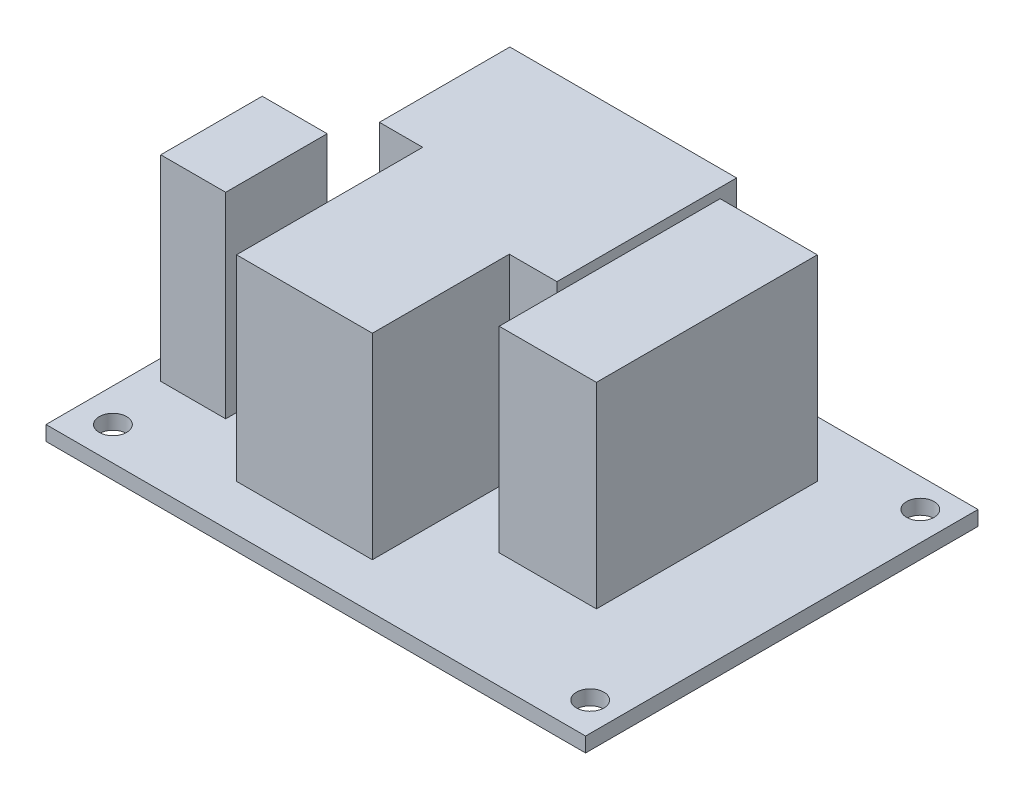
ISO-10303-21;
HEADER;
FILE_DESCRIPTION(('STEP AP214'),'2;1');
FILE_NAME('part.step','',(''),(''),'','','');
FILE_SCHEMA(('AUTOMOTIVE_DESIGN { 1 0 10303 214 1 1 1 1 }'));
ENDSEC;
DATA;
#1=APPLICATION_CONTEXT('core data for automotive mechanical design processes');
#2=APPLICATION_PROTOCOL_DEFINITION('international standard','automotive_design',2000,#1);
#3=PRODUCT_CONTEXT('',#1,'mechanical');
#4=PRODUCT('Part','Part','',(#3));
#5=PRODUCT_RELATED_PRODUCT_CATEGORY('part','',(#4));
#6=PRODUCT_DEFINITION_FORMATION('','',#4);
#7=PRODUCT_DEFINITION_CONTEXT('part definition',#1,'design');
#8=PRODUCT_DEFINITION('design','',#6,#7);
#9=PRODUCT_DEFINITION_SHAPE('','',#8);
#10=(LENGTH_UNIT() NAMED_UNIT(*) SI_UNIT(.MILLI.,.METRE.));
#11=(NAMED_UNIT(*) PLANE_ANGLE_UNIT() SI_UNIT($,.RADIAN.));
#12=(NAMED_UNIT(*) SI_UNIT($,.STERADIAN.) SOLID_ANGLE_UNIT());
#13=UNCERTAINTY_MEASURE_WITH_UNIT(LENGTH_MEASURE(1.E-05),#10,'distance_accuracy_value','');
#14=(GEOMETRIC_REPRESENTATION_CONTEXT(3) GLOBAL_UNCERTAINTY_ASSIGNED_CONTEXT((#13)) GLOBAL_UNIT_ASSIGNED_CONTEXT((#10,
#11,#12)) REPRESENTATION_CONTEXT('',''));
#15=CARTESIAN_POINT('',(0.,0.,0.));
#16=DIRECTION('',(0.,0.,1.));
#17=DIRECTION('',(1.,0.,0.));
#18=AXIS2_PLACEMENT_3D('',#15,#16,#17);
#19=CARTESIAN_POINT('',(0.,1.5,0.));
#20=DIRECTION('',(0.,1.,0.));
#21=DIRECTION('',(0.,0.,1.));
#22=AXIS2_PLACEMENT_3D('',#19,#20,#21);
#23=PLANE('',#22);
#24=DIRECTION('',(-1.,0.,0.));
#25=VECTOR('',#24,1.);
#26=CARTESIAN_POINT('',(5.93053954770105,1.5,-16.9641014969123));
#27=LINE('',#26,#25);
#28=CARTESIAN_POINT('',(5.93053954770105,1.5,-16.9641014969123));
#29=VERTEX_POINT('',#28);
#30=CARTESIAN_POINT('',(-17.1847727358965,1.5,-16.9641014969123));
#31=VERTEX_POINT('',#30);
#32=EDGE_CURVE('E200',#29,#31,#27,.T.);
#33=ORIENTED_EDGE('',*,*,#32,.F.);
#34=DIRECTION('',(0.,0.,-1.));
#35=VECTOR('',#34,1.);
#36=CARTESIAN_POINT('',(5.93053954770105,1.5,1.35161133877837));
#37=LINE('',#36,#35);
#38=CARTESIAN_POINT('',(5.93053954770105,1.5,1.35161133877837));
#39=VERTEX_POINT('',#38);
#40=EDGE_CURVE('E197',#39,#29,#37,.T.);
#41=ORIENTED_EDGE('',*,*,#40,.F.);
#42=DIRECTION('',(1.,0.,0.));
#43=VECTOR('',#42,1.);
#44=CARTESIAN_POINT('',(1.07577229004811,1.5,1.35161133877837));
#45=LINE('',#44,#43);
#46=CARTESIAN_POINT('',(1.07577229004811,1.5,1.35161133877837));
#47=VERTEX_POINT('',#46);
#48=EDGE_CURVE('E209',#47,#39,#45,.T.);
#49=ORIENTED_EDGE('',*,*,#48,.F.);
#50=DIRECTION('',(0.,0.,-1.));
#51=VECTOR('',#50,1.);
#52=CARTESIAN_POINT('',(1.07577229004811,1.5,15.3090672045306));
#53=LINE('',#52,#51);
#54=CARTESIAN_POINT('',(1.07577229004811,1.5,15.3090672045306));
#55=VERTEX_POINT('',#54);
#56=EDGE_CURVE('E233',#55,#47,#53,.T.);
#57=ORIENTED_EDGE('',*,*,#56,.F.);
#58=DIRECTION('',(1.,0.,0.));
#59=VECTOR('',#58,1.);
#60=CARTESIAN_POINT('',(-12.771347956212,1.5,15.3090672045306));
#61=LINE('',#60,#59);
#62=CARTESIAN_POINT('',(-12.771347956212,1.5,15.3090672045306));
#63=VERTEX_POINT('',#62);
#64=EDGE_CURVE('E231',#63,#55,#61,.T.);
#65=ORIENTED_EDGE('',*,*,#64,.F.);
#66=DIRECTION('',(0.,0.,1.));
#67=VECTOR('',#66,1.);
#68=CARTESIAN_POINT('',(-12.771347956212,1.5,-3.66865934811274));
#69=LINE('',#68,#67);
#70=CARTESIAN_POINT('',(-12.771347956212,1.5,-3.66865934811274));
#71=VERTEX_POINT('',#70);
#72=EDGE_CURVE('E229',#71,#63,#69,.T.);
#73=ORIENTED_EDGE('',*,*,#72,.F.);
#74=DIRECTION('',(1.,0.,0.));
#75=VECTOR('',#74,1.);
#76=CARTESIAN_POINT('',(-17.1847727358965,1.5,-3.66865934811274));
#77=LINE('',#76,#75);
#78=CARTESIAN_POINT('',(-17.1847727358965,1.5,-3.66865934811274));
#79=VERTEX_POINT('',#78);
#80=EDGE_CURVE('E227',#79,#71,#77,.T.);
#81=ORIENTED_EDGE('',*,*,#80,.F.);
#82=DIRECTION('',(0.,0.,1.));
#83=VECTOR('',#82,1.);
#84=CARTESIAN_POINT('',(-17.1847727358965,1.5,-16.9641014969123));
#85=LINE('',#84,#83);
#86=EDGE_CURVE('E225',#31,#79,#85,.T.);
#87=ORIENTED_EDGE('',*,*,#86,.F.);
#88=EDGE_LOOP('',(#33,#41,#49,#57,#65,#73,#81,#87));
#89=FACE_BOUND('',#88,.T.);
#90=CARTESIAN_POINT('',(24.56,1.5,-17.06));
#91=DIRECTION('',(0.,1.,0.));
#92=DIRECTION('',(0.,0.,1.));
#93=AXIS2_PLACEMENT_3D('',#90,#91,#92);
#94=CIRCLE('',#93,1.4);
#95=CARTESIAN_POINT('',(24.56,1.5,-15.66));
#96=VERTEX_POINT('',#95);
#97=EDGE_CURVE('E286',#96,#96,#94,.T.);
#98=ORIENTED_EDGE('',*,*,#97,.F.);
#99=EDGE_LOOP('',(#98));
#100=FACE_BOUND('',#99,.T.);
#101=CARTESIAN_POINT('',(-24.09,1.5,16.59));
#102=DIRECTION('',(0.,1.,0.));
#103=DIRECTION('',(0.,0.,1.));
#104=AXIS2_PLACEMENT_3D('',#101,#102,#103);
#105=CIRCLE('',#104,1.4);
#106=CARTESIAN_POINT('',(-24.09,1.5,17.99));
#107=VERTEX_POINT('',#106);
#108=EDGE_CURVE('E298',#107,#107,#105,.T.);
#109=ORIENTED_EDGE('',*,*,#108,.F.);
#110=EDGE_LOOP('',(#109));
#111=FACE_BOUND('',#110,.T.);
#112=DIRECTION('',(0.,0.,-1.));
#113=VECTOR('',#112,1.);
#114=CARTESIAN_POINT('',(27.5,1.5,-20.));
#115=LINE('',#114,#113);
#116=CARTESIAN_POINT('',(27.5,1.5,20.));
#117=VERTEX_POINT('',#116);
#118=CARTESIAN_POINT('',(27.5,1.5,-20.));
#119=VERTEX_POINT('',#118);
#120=EDGE_CURVE('E310',#117,#119,#115,.T.);
#121=ORIENTED_EDGE('',*,*,#120,.T.);
#122=DIRECTION('',(-1.,0.,0.));
#123=VECTOR('',#122,1.);
#124=CARTESIAN_POINT('',(-27.5,1.5,-20.));
#125=LINE('',#124,#123);
#126=CARTESIAN_POINT('',(-27.5,1.5,-20.));
#127=VERTEX_POINT('',#126);
#128=EDGE_CURVE('E313',#119,#127,#125,.T.);
#129=ORIENTED_EDGE('',*,*,#128,.T.);
#130=DIRECTION('',(0.,0.,1.));
#131=VECTOR('',#130,1.);
#132=CARTESIAN_POINT('',(-27.5,1.5,-20.));
#133=LINE('',#132,#131);
#134=CARTESIAN_POINT('',(-27.5,1.5,20.));
#135=VERTEX_POINT('',#134);
#136=EDGE_CURVE('E316',#127,#135,#133,.T.);
#137=ORIENTED_EDGE('',*,*,#136,.T.);
#138=DIRECTION('',(1.,0.,0.));
#139=VECTOR('',#138,1.);
#140=CARTESIAN_POINT('',(-27.5,1.5,20.));
#141=LINE('',#140,#139);
#142=EDGE_CURVE('E318',#135,#117,#141,.T.);
#143=ORIENTED_EDGE('',*,*,#142,.T.);
#144=EDGE_LOOP('',(#121,#129,#137,#143));
#145=FACE_BOUND('',#144,.T.);
#146=CARTESIAN_POINT('',(-24.09,1.5,-17.06));
#147=DIRECTION('',(0.,1.,0.));
#148=DIRECTION('',(0.,0.,1.));
#149=AXIS2_PLACEMENT_3D('',#146,#147,#148);
#150=CIRCLE('',#149,1.4);
#151=CARTESIAN_POINT('',(-24.09,1.5,-15.66));
#152=VERTEX_POINT('',#151);
#153=EDGE_CURVE('E304',#152,#152,#150,.T.);
#154=ORIENTED_EDGE('',*,*,#153,.F.);
#155=EDGE_LOOP('',(#154));
#156=FACE_BOUND('',#155,.T.);
#157=CARTESIAN_POINT('',(24.56,1.5,16.59));
#158=DIRECTION('',(0.,1.,0.));
#159=DIRECTION('',(0.,0.,1.));
#160=AXIS2_PLACEMENT_3D('',#157,#158,#159);
#161=CIRCLE('',#160,1.4);
#162=CARTESIAN_POINT('',(24.56,1.5,17.99));
#163=VERTEX_POINT('',#162);
#164=EDGE_CURVE('E292',#163,#163,#161,.T.);
#165=ORIENTED_EDGE('',*,*,#164,.F.);
#166=EDGE_LOOP('',(#165));
#167=FACE_BOUND('',#166,.T.);
#168=DIRECTION('',(-1.,0.,0.));
#169=VECTOR('',#168,1.);
#170=CARTESIAN_POINT('',(16.831699615409,1.5,-14.2895006996469));
#171=LINE('',#170,#169);
#172=CARTESIAN_POINT('',(16.831699615409,1.5,-14.2895006996469));
#173=VERTEX_POINT('',#172);
#174=CARTESIAN_POINT('',(6.92395716657757,1.5,-14.2895006996469));
#175=VERTEX_POINT('',#174);
#176=EDGE_CURVE('E270',#173,#175,#171,.T.);
#177=ORIENTED_EDGE('',*,*,#176,.F.);
#178=DIRECTION('',(0.,0.,-1.));
#179=VECTOR('',#178,1.);
#180=CARTESIAN_POINT('',(16.831699615409,1.5,8.22766873824321));
#181=LINE('',#180,#179);
#182=CARTESIAN_POINT('',(16.831699615409,1.5,8.22766873824321));
#183=VERTEX_POINT('',#182);
#184=EDGE_CURVE('E256',#183,#173,#181,.T.);
#185=ORIENTED_EDGE('',*,*,#184,.F.);
#186=DIRECTION('',(1.,0.,0.));
#187=VECTOR('',#186,1.);
#188=CARTESIAN_POINT('',(6.92395716657757,1.5,8.22766873824321));
#189=LINE('',#188,#187);
#190=CARTESIAN_POINT('',(6.92395716657757,1.5,8.22766873824321));
#191=VERTEX_POINT('',#190);
#192=EDGE_CURVE('E261',#191,#183,#189,.T.);
#193=ORIENTED_EDGE('',*,*,#192,.F.);
#194=DIRECTION('',(0.,0.,1.));
#195=VECTOR('',#194,1.);
#196=CARTESIAN_POINT('',(6.92395716657757,1.5,-14.2895006996469));
#197=LINE('',#196,#195);
#198=EDGE_CURVE('E272',#175,#191,#197,.T.);
#199=ORIENTED_EDGE('',*,*,#198,.F.);
#200=EDGE_LOOP('',(#177,#185,#193,#199));
#201=FACE_BOUND('',#200,.T.);
#202=DIRECTION('',(-1.,0.,0.));
#203=VECTOR('',#202,1.);
#204=CARTESIAN_POINT('',(-18.8398070282782,1.5,0.));
#205=LINE('',#204,#203);
#206=CARTESIAN_POINT('',(-18.8398070282782,1.5,0.));
#207=VERTEX_POINT('',#206);
#208=CARTESIAN_POINT('',(-25.4599441978049,1.5,0.));
#209=VERTEX_POINT('',#208);
#210=EDGE_CURVE('E398',#207,#209,#205,.T.);
#211=ORIENTED_EDGE('',*,*,#210,.F.);
#212=DIRECTION('',(0.,0.,-1.));
#213=VECTOR('',#212,1.);
#214=CARTESIAN_POINT('',(-18.8398070282782,1.5,10.3439643273855));
#215=LINE('',#214,#213);
#216=CARTESIAN_POINT('',(-18.8398070282782,1.5,10.3439643273855));
#217=VERTEX_POINT('',#216);
#218=EDGE_CURVE('E195',#217,#207,#215,.T.);
#219=ORIENTED_EDGE('',*,*,#218,.F.);
#220=DIRECTION('',(1.,0.,0.));
#221=VECTOR('',#220,1.);
#222=CARTESIAN_POINT('',(-25.4599441978049,1.5,10.3439643273855));
#223=LINE('',#222,#221);
#224=CARTESIAN_POINT('',(-25.4599441978049,1.5,10.3439643273855));
#225=VERTEX_POINT('',#224);
#226=EDGE_CURVE('E191',#225,#217,#223,.T.);
#227=ORIENTED_EDGE('',*,*,#226,.F.);
#228=DIRECTION('',(0.,0.,1.));
#229=VECTOR('',#228,1.);
#230=CARTESIAN_POINT('',(-25.4599441978049,1.5,0.));
#231=LINE('',#230,#229);
#232=EDGE_CURVE('E400',#209,#225,#231,.T.);
#233=ORIENTED_EDGE('',*,*,#232,.F.);
#234=EDGE_LOOP('',(#211,#219,#227,#233));
#235=FACE_BOUND('',#234,.T.);
#236=ADVANCED_FACE('F34',(#89,#100,#111,#145,#156,#167,#201,#235),#23,.T.);
#237=CARTESIAN_POINT('',(0.,0.,0.));
#238=DIRECTION('',(0.,1.,0.));
#239=DIRECTION('',(0.,0.,1.));
#240=AXIS2_PLACEMENT_3D('',#237,#238,#239);
#241=PLANE('',#240);
#242=CARTESIAN_POINT('',(24.56,0.,16.59));
#243=DIRECTION('',(0.,1.,0.));
#244=DIRECTION('',(0.,0.,1.));
#245=AXIS2_PLACEMENT_3D('',#242,#243,#244);
#246=CIRCLE('',#245,1.4);
#247=CARTESIAN_POINT('',(24.56,0.,17.99));
#248=VERTEX_POINT('',#247);
#249=EDGE_CURVE('E289',#248,#248,#246,.T.);
#250=ORIENTED_EDGE('',*,*,#249,.T.);
#251=EDGE_LOOP('',(#250));
#252=FACE_BOUND('',#251,.T.);
#253=CARTESIAN_POINT('',(-24.09,0.,-17.06));
#254=DIRECTION('',(0.,1.,0.));
#255=DIRECTION('',(0.,0.,1.));
#256=AXIS2_PLACEMENT_3D('',#253,#254,#255);
#257=CIRCLE('',#256,1.4);
#258=CARTESIAN_POINT('',(-24.09,0.,-15.66));
#259=VERTEX_POINT('',#258);
#260=EDGE_CURVE('E301',#259,#259,#257,.T.);
#261=ORIENTED_EDGE('',*,*,#260,.T.);
#262=EDGE_LOOP('',(#261));
#263=FACE_BOUND('',#262,.T.);
#264=DIRECTION('',(0.,0.,-1.));
#265=VECTOR('',#264,1.);
#266=CARTESIAN_POINT('',(27.5,0.,-20.));
#267=LINE('',#266,#265);
#268=CARTESIAN_POINT('',(27.5,0.,20.));
#269=VERTEX_POINT('',#268);
#270=CARTESIAN_POINT('',(27.5,0.,-20.));
#271=VERTEX_POINT('',#270);
#272=EDGE_CURVE('E307',#269,#271,#267,.T.);
#273=ORIENTED_EDGE('',*,*,#272,.F.);
#274=DIRECTION('',(1.,0.,0.));
#275=VECTOR('',#274,1.);
#276=CARTESIAN_POINT('',(-27.5,0.,20.));
#277=LINE('',#276,#275);
#278=CARTESIAN_POINT('',(-27.5,0.,20.));
#279=VERTEX_POINT('',#278);
#280=EDGE_CURVE('E314',#279,#269,#277,.T.);
#281=ORIENTED_EDGE('',*,*,#280,.F.);
#282=DIRECTION('',(0.,0.,1.));
#283=VECTOR('',#282,1.);
#284=CARTESIAN_POINT('',(-27.5,0.,-20.));
#285=LINE('',#284,#283);
#286=CARTESIAN_POINT('',(-27.5,0.,-20.));
#287=VERTEX_POINT('',#286);
#288=EDGE_CURVE('E325',#287,#279,#285,.T.);
#289=ORIENTED_EDGE('',*,*,#288,.F.);
#290=DIRECTION('',(-1.,0.,0.));
#291=VECTOR('',#290,1.);
#292=CARTESIAN_POINT('',(-27.5,0.,-20.));
#293=LINE('',#292,#291);
#294=EDGE_CURVE('E323',#271,#287,#293,.T.);
#295=ORIENTED_EDGE('',*,*,#294,.F.);
#296=EDGE_LOOP('',(#273,#281,#289,#295));
#297=FACE_BOUND('',#296,.T.);
#298=CARTESIAN_POINT('',(-24.09,0.,16.59));
#299=DIRECTION('',(0.,1.,0.));
#300=DIRECTION('',(0.,0.,1.));
#301=AXIS2_PLACEMENT_3D('',#298,#299,#300);
#302=CIRCLE('',#301,1.4);
#303=CARTESIAN_POINT('',(-24.09,0.,17.99));
#304=VERTEX_POINT('',#303);
#305=EDGE_CURVE('E295',#304,#304,#302,.T.);
#306=ORIENTED_EDGE('',*,*,#305,.T.);
#307=EDGE_LOOP('',(#306));
#308=FACE_BOUND('',#307,.T.);
#309=CARTESIAN_POINT('',(24.56,0.,-17.06));
#310=DIRECTION('',(0.,1.,0.));
#311=DIRECTION('',(0.,0.,1.));
#312=AXIS2_PLACEMENT_3D('',#309,#310,#311);
#313=CIRCLE('',#312,1.4);
#314=CARTESIAN_POINT('',(24.56,0.,-15.66));
#315=VERTEX_POINT('',#314);
#316=EDGE_CURVE('E285',#315,#315,#313,.T.);
#317=ORIENTED_EDGE('',*,*,#316,.T.);
#318=EDGE_LOOP('',(#317));
#319=FACE_BOUND('',#318,.T.);
#320=ADVANCED_FACE('F343',(#252,#263,#297,#308,#319),#241,.F.);
#321=CARTESIAN_POINT('',(27.5,1.5,-20.));
#322=DIRECTION('',(-1.,0.,0.));
#323=DIRECTION('',(0.,0.,1.));
#324=AXIS2_PLACEMENT_3D('',#321,#322,#323);
#325=PLANE('',#324);
#326=ORIENTED_EDGE('',*,*,#272,.T.);
#327=DIRECTION('',(0.,-1.,0.));
#328=VECTOR('',#327,1.);
#329=CARTESIAN_POINT('',(27.5,1.5,-20.));
#330=LINE('',#329,#328);
#331=EDGE_CURVE('E11',#119,#271,#330,.T.);
#332=ORIENTED_EDGE('',*,*,#331,.F.);
#333=ORIENTED_EDGE('',*,*,#120,.F.);
#334=DIRECTION('',(0.,-1.,0.));
#335=VECTOR('',#334,1.);
#336=CARTESIAN_POINT('',(27.5,1.5,20.));
#337=LINE('',#336,#335);
#338=EDGE_CURVE('E320',#117,#269,#337,.T.);
#339=ORIENTED_EDGE('',*,*,#338,.T.);
#340=EDGE_LOOP('',(#326,#332,#333,#339));
#341=FACE_BOUND('',#340,.T.);
#342=ADVANCED_FACE('F36',(#341),#325,.F.);
#343=CARTESIAN_POINT('',(-27.5,1.5,-20.));
#344=DIRECTION('',(0.,0.,1.));
#345=DIRECTION('',(1.,0.,0.));
#346=AXIS2_PLACEMENT_3D('',#343,#344,#345);
#347=PLANE('',#346);
#348=ORIENTED_EDGE('',*,*,#294,.T.);
#349=DIRECTION('',(0.,-1.,0.));
#350=VECTOR('',#349,1.);
#351=CARTESIAN_POINT('',(-27.5,1.5,-20.));
#352=LINE('',#351,#350);
#353=EDGE_CURVE('E42',#127,#287,#352,.T.);
#354=ORIENTED_EDGE('',*,*,#353,.F.);
#355=ORIENTED_EDGE('',*,*,#128,.F.);
#356=ORIENTED_EDGE('',*,*,#331,.T.);
#357=EDGE_LOOP('',(#348,#354,#355,#356));
#358=FACE_BOUND('',#357,.T.);
#359=ADVANCED_FACE('F354',(#358),#347,.F.);
#360=CARTESIAN_POINT('',(-27.5,1.5,-20.));
#361=DIRECTION('',(1.,0.,0.));
#362=DIRECTION('',(0.,0.,-1.));
#363=AXIS2_PLACEMENT_3D('',#360,#361,#362);
#364=PLANE('',#363);
#365=ORIENTED_EDGE('',*,*,#288,.T.);
#366=DIRECTION('',(0.,-1.,0.));
#367=VECTOR('',#366,1.);
#368=CARTESIAN_POINT('',(-27.5,1.5,20.));
#369=LINE('',#368,#367);
#370=EDGE_CURVE('E330',#135,#279,#369,.T.);
#371=ORIENTED_EDGE('',*,*,#370,.F.);
#372=ORIENTED_EDGE('',*,*,#136,.F.);
#373=ORIENTED_EDGE('',*,*,#353,.T.);
#374=EDGE_LOOP('',(#365,#371,#372,#373));
#375=FACE_BOUND('',#374,.T.);
#376=ADVANCED_FACE('F337',(#375),#364,.F.);
#377=CARTESIAN_POINT('',(-27.5,1.5,20.));
#378=DIRECTION('',(0.,0.,-1.));
#379=DIRECTION('',(-1.,0.,0.));
#380=AXIS2_PLACEMENT_3D('',#377,#378,#379);
#381=PLANE('',#380);
#382=ORIENTED_EDGE('',*,*,#280,.T.);
#383=ORIENTED_EDGE('',*,*,#338,.F.);
#384=ORIENTED_EDGE('',*,*,#142,.F.);
#385=ORIENTED_EDGE('',*,*,#370,.T.);
#386=EDGE_LOOP('',(#382,#383,#384,#385));
#387=FACE_BOUND('',#386,.T.);
#388=ADVANCED_FACE('F347',(#387),#381,.F.);
#389=CARTESIAN_POINT('',(-24.09,1.5,-17.06));
#390=DIRECTION('',(0.,-1.,0.));
#391=DIRECTION('',(0.,0.,-1.));
#392=AXIS2_PLACEMENT_3D('',#389,#390,#391);
#393=CYLINDRICAL_SURFACE('',#392,1.4);
#394=ORIENTED_EDGE('',*,*,#153,.T.);
#395=EDGE_LOOP('',(#394));
#396=FACE_BOUND('',#395,.T.);
#397=ORIENTED_EDGE('',*,*,#260,.F.);
#398=EDGE_LOOP('',(#397));
#399=FACE_BOUND('',#398,.T.);
#400=ADVANCED_FACE('F372',(#396,#399),#393,.F.);
#401=CARTESIAN_POINT('',(-24.09,1.5,16.59));
#402=DIRECTION('',(0.,-1.,0.));
#403=DIRECTION('',(0.,0.,-1.));
#404=AXIS2_PLACEMENT_3D('',#401,#402,#403);
#405=CYLINDRICAL_SURFACE('',#404,1.4);
#406=ORIENTED_EDGE('',*,*,#108,.T.);
#407=EDGE_LOOP('',(#406));
#408=FACE_BOUND('',#407,.T.);
#409=ORIENTED_EDGE('',*,*,#305,.F.);
#410=EDGE_LOOP('',(#409));
#411=FACE_BOUND('',#410,.T.);
#412=ADVANCED_FACE('F379',(#408,#411),#405,.F.);
#413=CARTESIAN_POINT('',(24.56,1.5,16.59));
#414=DIRECTION('',(0.,-1.,0.));
#415=DIRECTION('',(0.,0.,-1.));
#416=AXIS2_PLACEMENT_3D('',#413,#414,#415);
#417=CYLINDRICAL_SURFACE('',#416,1.4);
#418=ORIENTED_EDGE('',*,*,#164,.T.);
#419=EDGE_LOOP('',(#418));
#420=FACE_BOUND('',#419,.T.);
#421=ORIENTED_EDGE('',*,*,#249,.F.);
#422=EDGE_LOOP('',(#421));
#423=FACE_BOUND('',#422,.T.);
#424=ADVANCED_FACE('F384',(#420,#423),#417,.F.);
#425=CARTESIAN_POINT('',(24.56,1.5,-17.06));
#426=DIRECTION('',(0.,-1.,0.));
#427=DIRECTION('',(0.,0.,-1.));
#428=AXIS2_PLACEMENT_3D('',#425,#426,#427);
#429=CYLINDRICAL_SURFACE('',#428,1.4);
#430=ORIENTED_EDGE('',*,*,#97,.T.);
#431=EDGE_LOOP('',(#430));
#432=FACE_BOUND('',#431,.T.);
#433=ORIENTED_EDGE('',*,*,#316,.F.);
#434=EDGE_LOOP('',(#433));
#435=FACE_BOUND('',#434,.T.);
#436=ADVANCED_FACE('F479',(#432,#435),#429,.F.);
#437=CARTESIAN_POINT('',(16.831699615409,21.5,8.22766873824321));
#438=DIRECTION('',(-1.,0.,0.));
#439=DIRECTION('',(0.,0.,1.));
#440=AXIS2_PLACEMENT_3D('',#437,#438,#439);
#441=PLANE('',#440);
#442=ORIENTED_EDGE('',*,*,#184,.T.);
#443=DIRECTION('',(0.,-1.,0.));
#444=VECTOR('',#443,1.);
#445=CARTESIAN_POINT('',(16.831699615409,21.5,-14.2895006996469));
#446=LINE('',#445,#444);
#447=CARTESIAN_POINT('',(16.831699615409,21.5,-14.2895006996469));
#448=VERTEX_POINT('',#447);
#449=EDGE_CURVE('E283',#448,#173,#446,.T.);
#450=ORIENTED_EDGE('',*,*,#449,.F.);
#451=DIRECTION('',(0.,0.,-1.));
#452=VECTOR('',#451,1.);
#453=CARTESIAN_POINT('',(16.831699615409,21.5,8.22766873824321));
#454=LINE('',#453,#452);
#455=CARTESIAN_POINT('',(16.831699615409,21.5,8.22766873824321));
#456=VERTEX_POINT('',#455);
#457=EDGE_CURVE('E257',#456,#448,#454,.T.);
#458=ORIENTED_EDGE('',*,*,#457,.F.);
#459=DIRECTION('',(0.,-1.,0.));
#460=VECTOR('',#459,1.);
#461=CARTESIAN_POINT('',(16.831699615409,21.5,8.22766873824321));
#462=LINE('',#461,#460);
#463=EDGE_CURVE('E267',#456,#183,#462,.T.);
#464=ORIENTED_EDGE('',*,*,#463,.T.);
#465=EDGE_LOOP('',(#442,#450,#458,#464));
#466=FACE_BOUND('',#465,.T.);
#467=ADVANCED_FACE('F475',(#466),#441,.F.);
#468=CARTESIAN_POINT('',(16.831699615409,21.5,-14.2895006996469));
#469=DIRECTION('',(0.,0.,1.));
#470=DIRECTION('',(1.,0.,0.));
#471=AXIS2_PLACEMENT_3D('',#468,#469,#470);
#472=PLANE('',#471);
#473=ORIENTED_EDGE('',*,*,#176,.T.);
#474=DIRECTION('',(0.,-1.,0.));
#475=VECTOR('',#474,1.);
#476=CARTESIAN_POINT('',(6.92395716657757,21.5,-14.2895006996469));
#477=LINE('',#476,#475);
#478=CARTESIAN_POINT('',(6.92395716657757,21.5,-14.2895006996469));
#479=VERTEX_POINT('',#478);
#480=EDGE_CURVE('E280',#479,#175,#477,.T.);
#481=ORIENTED_EDGE('',*,*,#480,.F.);
#482=DIRECTION('',(-1.,0.,0.));
#483=VECTOR('',#482,1.);
#484=CARTESIAN_POINT('',(16.831699615409,21.5,-14.2895006996469));
#485=LINE('',#484,#483);
#486=EDGE_CURVE('E260',#448,#479,#485,.T.);
#487=ORIENTED_EDGE('',*,*,#486,.F.);
#488=ORIENTED_EDGE('',*,*,#449,.T.);
#489=EDGE_LOOP('',(#473,#481,#487,#488));
#490=FACE_BOUND('',#489,.T.);
#491=ADVANCED_FACE('F471',(#490),#472,.F.);
#492=CARTESIAN_POINT('',(6.92395716657757,21.5,-14.2895006996469));
#493=DIRECTION('',(1.,0.,0.));
#494=DIRECTION('',(0.,0.,-1.));
#495=AXIS2_PLACEMENT_3D('',#492,#493,#494);
#496=PLANE('',#495);
#497=ORIENTED_EDGE('',*,*,#198,.T.);
#498=DIRECTION('',(0.,-1.,0.));
#499=VECTOR('',#498,1.);
#500=CARTESIAN_POINT('',(6.92395716657757,21.5,8.22766873824321));
#501=LINE('',#500,#499);
#502=CARTESIAN_POINT('',(6.92395716657757,21.5,8.22766873824321));
#503=VERTEX_POINT('',#502);
#504=EDGE_CURVE('E278',#503,#191,#501,.T.);
#505=ORIENTED_EDGE('',*,*,#504,.F.);
#506=DIRECTION('',(0.,0.,1.));
#507=VECTOR('',#506,1.);
#508=CARTESIAN_POINT('',(6.92395716657757,21.5,-14.2895006996469));
#509=LINE('',#508,#507);
#510=EDGE_CURVE('E263',#479,#503,#509,.T.);
#511=ORIENTED_EDGE('',*,*,#510,.F.);
#512=ORIENTED_EDGE('',*,*,#480,.T.);
#513=EDGE_LOOP('',(#497,#505,#511,#512));
#514=FACE_BOUND('',#513,.T.);
#515=ADVANCED_FACE('F467',(#514),#496,.F.);
#516=CARTESIAN_POINT('',(6.92395716657757,21.5,8.22766873824321));
#517=DIRECTION('',(0.,0.,-1.));
#518=DIRECTION('',(-1.,0.,0.));
#519=AXIS2_PLACEMENT_3D('',#516,#517,#518);
#520=PLANE('',#519);
#521=ORIENTED_EDGE('',*,*,#192,.T.);
#522=ORIENTED_EDGE('',*,*,#463,.F.);
#523=DIRECTION('',(1.,0.,0.));
#524=VECTOR('',#523,1.);
#525=CARTESIAN_POINT('',(6.92395716657757,21.5,8.22766873824321));
#526=LINE('',#525,#524);
#527=EDGE_CURVE('E265',#503,#456,#526,.T.);
#528=ORIENTED_EDGE('',*,*,#527,.F.);
#529=ORIENTED_EDGE('',*,*,#504,.T.);
#530=EDGE_LOOP('',(#521,#522,#528,#529));
#531=FACE_BOUND('',#530,.T.);
#532=ADVANCED_FACE('F463',(#531),#520,.F.);
#533=CARTESIAN_POINT('',(0.,21.5,0.));
#534=DIRECTION('',(0.,1.,0.));
#535=DIRECTION('',(0.,0.,1.));
#536=AXIS2_PLACEMENT_3D('',#533,#534,#535);
#537=PLANE('',#536);
#538=ORIENTED_EDGE('',*,*,#457,.T.);
#539=ORIENTED_EDGE('',*,*,#486,.T.);
#540=ORIENTED_EDGE('',*,*,#510,.T.);
#541=ORIENTED_EDGE('',*,*,#527,.T.);
#542=EDGE_LOOP('',(#538,#539,#540,#541));
#543=FACE_BOUND('',#542,.T.);
#544=ADVANCED_FACE('F459',(#543),#537,.T.);
#545=CARTESIAN_POINT('',(5.93053954770105,21.5,1.35161133877837));
#546=DIRECTION('',(-1.,0.,0.));
#547=DIRECTION('',(0.,0.,1.));
#548=AXIS2_PLACEMENT_3D('',#545,#546,#547);
#549=PLANE('',#548);
#550=ORIENTED_EDGE('',*,*,#40,.T.);
#551=DIRECTION('',(0.,-1.,0.));
#552=VECTOR('',#551,1.);
#553=CARTESIAN_POINT('',(5.93053954770105,21.5,-16.9641014969123));
#554=LINE('',#553,#552);
#555=CARTESIAN_POINT('',(5.93053954770105,21.5,-16.9641014969123));
#556=VERTEX_POINT('',#555);
#557=EDGE_CURVE('E254',#556,#29,#554,.T.);
#558=ORIENTED_EDGE('',*,*,#557,.F.);
#559=DIRECTION('',(0.,0.,-1.));
#560=VECTOR('',#559,1.);
#561=CARTESIAN_POINT('',(5.93053954770105,21.5,1.35161133877837));
#562=LINE('',#561,#560);
#563=CARTESIAN_POINT('',(5.93053954770105,21.5,1.35161133877837));
#564=VERTEX_POINT('',#563);
#565=EDGE_CURVE('E205',#564,#556,#562,.T.);
#566=ORIENTED_EDGE('',*,*,#565,.F.);
#567=DIRECTION('',(0.,-1.,0.));
#568=VECTOR('',#567,1.);
#569=CARTESIAN_POINT('',(5.93053954770105,21.5,1.35161133877837));
#570=LINE('',#569,#568);
#571=EDGE_CURVE('E222',#564,#39,#570,.T.);
#572=ORIENTED_EDGE('',*,*,#571,.T.);
#573=EDGE_LOOP('',(#550,#558,#566,#572));
#574=FACE_BOUND('',#573,.T.);
#575=ADVANCED_FACE('F455',(#574),#549,.F.);
#576=CARTESIAN_POINT('',(5.93053954770105,21.5,-16.9641014969123));
#577=DIRECTION('',(0.,0.,1.));
#578=DIRECTION('',(1.,0.,0.));
#579=AXIS2_PLACEMENT_3D('',#576,#577,#578);
#580=PLANE('',#579);
#581=ORIENTED_EDGE('',*,*,#32,.T.);
#582=DIRECTION('',(0.,-1.,0.));
#583=VECTOR('',#582,1.);
#584=CARTESIAN_POINT('',(-17.1847727358965,21.5,-16.9641014969123));
#585=LINE('',#584,#583);
#586=CARTESIAN_POINT('',(-17.1847727358965,21.5,-16.9641014969123));
#587=VERTEX_POINT('',#586);
#588=EDGE_CURVE('E251',#587,#31,#585,.T.);
#589=ORIENTED_EDGE('',*,*,#588,.F.);
#590=DIRECTION('',(-1.,0.,0.));
#591=VECTOR('',#590,1.);
#592=CARTESIAN_POINT('',(5.93053954770105,21.5,-16.9641014969123));
#593=LINE('',#592,#591);
#594=EDGE_CURVE('E208',#556,#587,#593,.T.);
#595=ORIENTED_EDGE('',*,*,#594,.F.);
#596=ORIENTED_EDGE('',*,*,#557,.T.);
#597=EDGE_LOOP('',(#581,#589,#595,#596));
#598=FACE_BOUND('',#597,.T.);
#599=ADVANCED_FACE('F451',(#598),#580,.F.);
#600=CARTESIAN_POINT('',(-17.1847727358965,21.5,-16.9641014969123));
#601=DIRECTION('',(1.,0.,0.));
#602=DIRECTION('',(0.,0.,-1.));
#603=AXIS2_PLACEMENT_3D('',#600,#601,#602);
#604=PLANE('',#603);
#605=ORIENTED_EDGE('',*,*,#86,.T.);
#606=DIRECTION('',(0.,-1.,0.));
#607=VECTOR('',#606,1.);
#608=CARTESIAN_POINT('',(-17.1847727358965,21.5,-3.66865934811274));
#609=LINE('',#608,#607);
#610=CARTESIAN_POINT('',(-17.1847727358965,21.5,-3.66865934811274));
#611=VERTEX_POINT('',#610);
#612=EDGE_CURVE('E248',#611,#79,#609,.T.);
#613=ORIENTED_EDGE('',*,*,#612,.F.);
#614=DIRECTION('',(0.,0.,1.));
#615=VECTOR('',#614,1.);
#616=CARTESIAN_POINT('',(-17.1847727358965,21.5,-16.9641014969123));
#617=LINE('',#616,#615);
#618=EDGE_CURVE('E211',#587,#611,#617,.T.);
#619=ORIENTED_EDGE('',*,*,#618,.F.);
#620=ORIENTED_EDGE('',*,*,#588,.T.);
#621=EDGE_LOOP('',(#605,#613,#619,#620));
#622=FACE_BOUND('',#621,.T.);
#623=ADVANCED_FACE('F447',(#622),#604,.F.);
#624=CARTESIAN_POINT('',(-17.1847727358965,21.5,-3.66865934811274));
#625=DIRECTION('',(0.,0.,-1.));
#626=DIRECTION('',(-1.,0.,0.));
#627=AXIS2_PLACEMENT_3D('',#624,#625,#626);
#628=PLANE('',#627);
#629=ORIENTED_EDGE('',*,*,#80,.T.);
#630=DIRECTION('',(0.,-1.,0.));
#631=VECTOR('',#630,1.);
#632=CARTESIAN_POINT('',(-12.771347956212,21.5,-3.66865934811274));
#633=LINE('',#632,#631);
#634=CARTESIAN_POINT('',(-12.771347956212,21.5,-3.66865934811274));
#635=VERTEX_POINT('',#634);
#636=EDGE_CURVE('E245',#635,#71,#633,.T.);
#637=ORIENTED_EDGE('',*,*,#636,.F.);
#638=DIRECTION('',(1.,0.,0.));
#639=VECTOR('',#638,1.);
#640=CARTESIAN_POINT('',(-17.1847727358965,21.5,-3.66865934811274));
#641=LINE('',#640,#639);
#642=EDGE_CURVE('E213',#611,#635,#641,.T.);
#643=ORIENTED_EDGE('',*,*,#642,.F.);
#644=ORIENTED_EDGE('',*,*,#612,.T.);
#645=EDGE_LOOP('',(#629,#637,#643,#644));
#646=FACE_BOUND('',#645,.T.);
#647=ADVANCED_FACE('F443',(#646),#628,.F.);
#648=CARTESIAN_POINT('',(-12.771347956212,21.5,-3.66865934811274));
#649=DIRECTION('',(1.,0.,0.));
#650=DIRECTION('',(0.,0.,-1.));
#651=AXIS2_PLACEMENT_3D('',#648,#649,#650);
#652=PLANE('',#651);
#653=ORIENTED_EDGE('',*,*,#72,.T.);
#654=DIRECTION('',(0.,-1.,0.));
#655=VECTOR('',#654,1.);
#656=CARTESIAN_POINT('',(-12.771347956212,21.5,15.3090672045306));
#657=LINE('',#656,#655);
#658=CARTESIAN_POINT('',(-12.771347956212,21.5,15.3090672045306));
#659=VERTEX_POINT('',#658);
#660=EDGE_CURVE('E242',#659,#63,#657,.T.);
#661=ORIENTED_EDGE('',*,*,#660,.F.);
#662=DIRECTION('',(0.,0.,1.));
#663=VECTOR('',#662,1.);
#664=CARTESIAN_POINT('',(-12.771347956212,21.5,-3.66865934811274));
#665=LINE('',#664,#663);
#666=EDGE_CURVE('E215',#635,#659,#665,.T.);
#667=ORIENTED_EDGE('',*,*,#666,.F.);
#668=ORIENTED_EDGE('',*,*,#636,.T.);
#669=EDGE_LOOP('',(#653,#661,#667,#668));
#670=FACE_BOUND('',#669,.T.);
#671=ADVANCED_FACE('F439',(#670),#652,.F.);
#672=CARTESIAN_POINT('',(-12.771347956212,21.5,15.3090672045306));
#673=DIRECTION('',(0.,0.,-1.));
#674=DIRECTION('',(-1.,0.,0.));
#675=AXIS2_PLACEMENT_3D('',#672,#673,#674);
#676=PLANE('',#675);
#677=ORIENTED_EDGE('',*,*,#64,.T.);
#678=DIRECTION('',(0.,-1.,0.));
#679=VECTOR('',#678,1.);
#680=CARTESIAN_POINT('',(1.07577229004811,21.5,15.3090672045306));
#681=LINE('',#680,#679);
#682=CARTESIAN_POINT('',(1.07577229004811,21.5,15.3090672045306));
#683=VERTEX_POINT('',#682);
#684=EDGE_CURVE('E239',#683,#55,#681,.T.);
#685=ORIENTED_EDGE('',*,*,#684,.F.);
#686=DIRECTION('',(1.,0.,0.));
#687=VECTOR('',#686,1.);
#688=CARTESIAN_POINT('',(-12.771347956212,21.5,15.3090672045306));
#689=LINE('',#688,#687);
#690=EDGE_CURVE('E217',#659,#683,#689,.T.);
#691=ORIENTED_EDGE('',*,*,#690,.F.);
#692=ORIENTED_EDGE('',*,*,#660,.T.);
#693=EDGE_LOOP('',(#677,#685,#691,#692));
#694=FACE_BOUND('',#693,.T.);
#695=ADVANCED_FACE('F435',(#694),#676,.F.);
#696=CARTESIAN_POINT('',(1.07577229004811,21.5,15.3090672045306));
#697=DIRECTION('',(-1.,0.,0.));
#698=DIRECTION('',(0.,0.,1.));
#699=AXIS2_PLACEMENT_3D('',#696,#697,#698);
#700=PLANE('',#699);
#701=ORIENTED_EDGE('',*,*,#56,.T.);
#702=DIRECTION('',(0.,-1.,0.));
#703=VECTOR('',#702,1.);
#704=CARTESIAN_POINT('',(1.07577229004811,21.5,1.35161133877837));
#705=LINE('',#704,#703);
#706=CARTESIAN_POINT('',(1.07577229004811,21.5,1.35161133877837));
#707=VERTEX_POINT('',#706);
#708=EDGE_CURVE('E57',#707,#47,#705,.T.);
#709=ORIENTED_EDGE('',*,*,#708,.F.);
#710=DIRECTION('',(0.,0.,-1.));
#711=VECTOR('',#710,1.);
#712=CARTESIAN_POINT('',(1.07577229004811,21.5,15.3090672045306));
#713=LINE('',#712,#711);
#714=EDGE_CURVE('E219',#683,#707,#713,.T.);
#715=ORIENTED_EDGE('',*,*,#714,.F.);
#716=ORIENTED_EDGE('',*,*,#684,.T.);
#717=EDGE_LOOP('',(#701,#709,#715,#716));
#718=FACE_BOUND('',#717,.T.);
#719=ADVANCED_FACE('F432',(#718),#700,.F.);
#720=CARTESIAN_POINT('',(1.07577229004811,21.5,1.35161133877837));
#721=DIRECTION('',(0.,0.,-1.));
#722=DIRECTION('',(-1.,0.,0.));
#723=AXIS2_PLACEMENT_3D('',#720,#721,#722);
#724=PLANE('',#723);
#725=ORIENTED_EDGE('',*,*,#48,.T.);
#726=ORIENTED_EDGE('',*,*,#571,.F.);
#727=DIRECTION('',(1.,0.,0.));
#728=VECTOR('',#727,1.);
#729=CARTESIAN_POINT('',(1.07577229004811,21.5,1.35161133877837));
#730=LINE('',#729,#728);
#731=EDGE_CURVE('E221',#707,#564,#730,.T.);
#732=ORIENTED_EDGE('',*,*,#731,.F.);
#733=ORIENTED_EDGE('',*,*,#708,.T.);
#734=EDGE_LOOP('',(#725,#726,#732,#733));
#735=FACE_BOUND('',#734,.T.);
#736=ADVANCED_FACE('F428',(#735),#724,.F.);
#737=CARTESIAN_POINT('',(0.,21.5,0.));
#738=DIRECTION('',(0.,1.,0.));
#739=DIRECTION('',(0.,0.,1.));
#740=AXIS2_PLACEMENT_3D('',#737,#738,#739);
#741=PLANE('',#740);
#742=ORIENTED_EDGE('',*,*,#565,.T.);
#743=ORIENTED_EDGE('',*,*,#594,.T.);
#744=ORIENTED_EDGE('',*,*,#618,.T.);
#745=ORIENTED_EDGE('',*,*,#642,.T.);
#746=ORIENTED_EDGE('',*,*,#666,.T.);
#747=ORIENTED_EDGE('',*,*,#690,.T.);
#748=ORIENTED_EDGE('',*,*,#714,.T.);
#749=ORIENTED_EDGE('',*,*,#731,.T.);
#750=EDGE_LOOP('',(#742,#743,#744,#745,#746,#747,#748,#749));
#751=FACE_BOUND('',#750,.T.);
#752=ADVANCED_FACE('F425',(#751),#741,.T.);
#753=CARTESIAN_POINT('',(-18.8398070282782,21.5,10.3439643273855));
#754=DIRECTION('',(-1.,0.,0.));
#755=DIRECTION('',(0.,0.,1.));
#756=AXIS2_PLACEMENT_3D('',#753,#754,#755);
#757=PLANE('',#756);
#758=ORIENTED_EDGE('',*,*,#218,.T.);
#759=DIRECTION('',(0.,-1.,0.));
#760=VECTOR('',#759,1.);
#761=CARTESIAN_POINT('',(-18.8398070282782,21.5,0.));
#762=LINE('',#761,#760);
#763=CARTESIAN_POINT('',(-18.8398070282782,21.5,0.));
#764=VERTEX_POINT('',#763);
#765=EDGE_CURVE('E176',#764,#207,#762,.T.);
#766=ORIENTED_EDGE('',*,*,#765,.F.);
#767=DIRECTION('',(0.,0.,-1.));
#768=VECTOR('',#767,1.);
#769=CARTESIAN_POINT('',(-18.8398070282782,21.5,10.3439643273855));
#770=LINE('',#769,#768);
#771=CARTESIAN_POINT('',(-18.8398070282782,21.5,10.3439643273855));
#772=VERTEX_POINT('',#771);
#773=EDGE_CURVE('E183',#772,#764,#770,.T.);
#774=ORIENTED_EDGE('',*,*,#773,.F.);
#775=DIRECTION('',(0.,-1.,0.));
#776=VECTOR('',#775,1.);
#777=CARTESIAN_POINT('',(-18.8398070282782,21.5,10.3439643273855));
#778=LINE('',#777,#776);
#779=EDGE_CURVE('E407',#772,#217,#778,.T.);
#780=ORIENTED_EDGE('',*,*,#779,.T.);
#781=EDGE_LOOP('',(#758,#766,#774,#780));
#782=FACE_BOUND('',#781,.T.);
#783=ADVANCED_FACE('F193',(#782),#757,.F.);
#784=CARTESIAN_POINT('',(-18.8398070282782,21.5,0.));
#785=DIRECTION('',(0.,0.,1.));
#786=DIRECTION('',(1.,0.,0.));
#787=AXIS2_PLACEMENT_3D('',#784,#785,#786);
#788=PLANE('',#787);
#789=ORIENTED_EDGE('',*,*,#210,.T.);
#790=DIRECTION('',(0.,-1.,0.));
#791=VECTOR('',#790,1.);
#792=CARTESIAN_POINT('',(-25.4599441978049,21.5,0.));
#793=LINE('',#792,#791);
#794=CARTESIAN_POINT('',(-25.4599441978049,21.5,0.));
#795=VERTEX_POINT('',#794);
#796=EDGE_CURVE('E179',#795,#209,#793,.T.);
#797=ORIENTED_EDGE('',*,*,#796,.F.);
#798=DIRECTION('',(-1.,0.,0.));
#799=VECTOR('',#798,1.);
#800=CARTESIAN_POINT('',(-18.8398070282782,21.5,0.));
#801=LINE('',#800,#799);
#802=EDGE_CURVE('E172',#764,#795,#801,.T.);
#803=ORIENTED_EDGE('',*,*,#802,.F.);
#804=ORIENTED_EDGE('',*,*,#765,.T.);
#805=EDGE_LOOP('',(#789,#797,#803,#804));
#806=FACE_BOUND('',#805,.T.);
#807=ADVANCED_FACE('F174',(#806),#788,.F.);
#808=CARTESIAN_POINT('',(-25.4599441978049,21.5,0.));
#809=DIRECTION('',(1.,0.,0.));
#810=DIRECTION('',(0.,0.,-1.));
#811=AXIS2_PLACEMENT_3D('',#808,#809,#810);
#812=PLANE('',#811);
#813=ORIENTED_EDGE('',*,*,#232,.T.);
#814=DIRECTION('',(0.,-1.,0.));
#815=VECTOR('',#814,1.);
#816=CARTESIAN_POINT('',(-25.4599441978049,21.5,10.3439643273855));
#817=LINE('',#816,#815);
#818=CARTESIAN_POINT('',(-25.4599441978049,21.5,10.3439643273855));
#819=VERTEX_POINT('',#818);
#820=EDGE_CURVE('E49',#819,#225,#817,.T.);
#821=ORIENTED_EDGE('',*,*,#820,.F.);
#822=DIRECTION('',(0.,0.,1.));
#823=VECTOR('',#822,1.);
#824=CARTESIAN_POINT('',(-25.4599441978049,21.5,0.));
#825=LINE('',#824,#823);
#826=EDGE_CURVE('E182',#795,#819,#825,.T.);
#827=ORIENTED_EDGE('',*,*,#826,.F.);
#828=ORIENTED_EDGE('',*,*,#796,.T.);
#829=EDGE_LOOP('',(#813,#821,#827,#828));
#830=FACE_BOUND('',#829,.T.);
#831=ADVANCED_FACE('F410',(#830),#812,.F.);
#832=CARTESIAN_POINT('',(-25.4599441978049,21.5,10.3439643273855));
#833=DIRECTION('',(0.,0.,-1.));
#834=DIRECTION('',(-1.,0.,0.));
#835=AXIS2_PLACEMENT_3D('',#832,#833,#834);
#836=PLANE('',#835);
#837=ORIENTED_EDGE('',*,*,#226,.T.);
#838=ORIENTED_EDGE('',*,*,#779,.F.);
#839=DIRECTION('',(1.,0.,0.));
#840=VECTOR('',#839,1.);
#841=CARTESIAN_POINT('',(-25.4599441978049,21.5,10.3439643273855));
#842=LINE('',#841,#840);
#843=EDGE_CURVE('E187',#819,#772,#842,.T.);
#844=ORIENTED_EDGE('',*,*,#843,.F.);
#845=ORIENTED_EDGE('',*,*,#820,.T.);
#846=EDGE_LOOP('',(#837,#838,#844,#845));
#847=FACE_BOUND('',#846,.T.);
#848=ADVANCED_FACE('F411',(#847),#836,.F.);
#849=CARTESIAN_POINT('',(0.,21.5,0.));
#850=DIRECTION('',(0.,1.,0.));
#851=DIRECTION('',(0.,0.,1.));
#852=AXIS2_PLACEMENT_3D('',#849,#850,#851);
#853=PLANE('',#852);
#854=ORIENTED_EDGE('',*,*,#773,.T.);
#855=ORIENTED_EDGE('',*,*,#802,.T.);
#856=ORIENTED_EDGE('',*,*,#826,.T.);
#857=ORIENTED_EDGE('',*,*,#843,.T.);
#858=EDGE_LOOP('',(#854,#855,#856,#857));
#859=FACE_BOUND('',#858,.T.);
#860=ADVANCED_FACE('F186',(#859),#853,.T.);
#861=CLOSED_SHELL('',(#236,#320,#342,#359,#376,#388,#400,#412,#424,#436,#467,#491,#515,#532,
#544,#575,#599,#623,#647,#671,#695,#719,#736,#752,#783,#807,#831,#848,#860));
#862=MANIFOLD_SOLID_BREP('B2',#861);
#863=ADVANCED_BREP_SHAPE_REPRESENTATION('',(#18,#862),#14);
#864=SHAPE_DEFINITION_REPRESENTATION(#9,#863);
ENDSEC;
END-ISO-10303-21;
